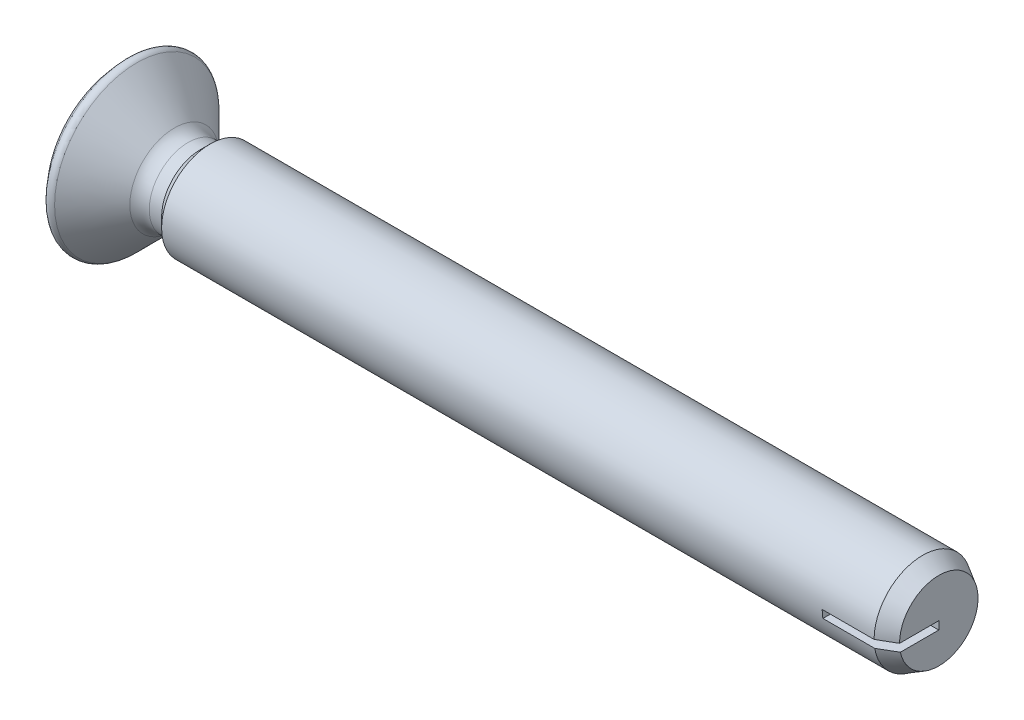
ISO-10303-21;
HEADER;
FILE_DESCRIPTION(('STEP AP214'),'2;1');
FILE_NAME('part.step','',(''),(''),'','','');
FILE_SCHEMA(('AUTOMOTIVE_DESIGN { 1 0 10303 214 1 1 1 1 }'));
ENDSEC;
DATA;
#1=APPLICATION_CONTEXT('core data for automotive mechanical design processes');
#2=APPLICATION_PROTOCOL_DEFINITION('international standard','automotive_design',2000,#1);
#3=PRODUCT_CONTEXT('',#1,'mechanical');
#4=PRODUCT('Part','Part','',(#3));
#5=PRODUCT_RELATED_PRODUCT_CATEGORY('part','',(#4));
#6=PRODUCT_DEFINITION_FORMATION('','',#4);
#7=PRODUCT_DEFINITION_CONTEXT('part definition',#1,'design');
#8=PRODUCT_DEFINITION('design','',#6,#7);
#9=PRODUCT_DEFINITION_SHAPE('','',#8);
#10=(LENGTH_UNIT() NAMED_UNIT(*) SI_UNIT(.MILLI.,.METRE.));
#11=(NAMED_UNIT(*) PLANE_ANGLE_UNIT() SI_UNIT($,.RADIAN.));
#12=(NAMED_UNIT(*) SI_UNIT($,.STERADIAN.) SOLID_ANGLE_UNIT());
#13=UNCERTAINTY_MEASURE_WITH_UNIT(LENGTH_MEASURE(1.E-05),#10,'distance_accuracy_value','');
#14=(GEOMETRIC_REPRESENTATION_CONTEXT(3) GLOBAL_UNCERTAINTY_ASSIGNED_CONTEXT((#13)) GLOBAL_UNIT_ASSIGNED_CONTEXT((#10,
#11,#12)) REPRESENTATION_CONTEXT('',''));
#15=CARTESIAN_POINT('',(0.,0.,0.));
#16=DIRECTION('',(0.,0.,1.));
#17=DIRECTION('',(1.,0.,0.));
#18=AXIS2_PLACEMENT_3D('',#15,#16,#17);
#19=CARTESIAN_POINT('',(0.,0.,0.));
#20=DIRECTION('',(-1.,0.,0.));
#21=DIRECTION('',(0.,0.,1.));
#22=AXIS2_PLACEMENT_3D('',#19,#20,#21);
#23=CYLINDRICAL_SURFACE('',#22,5.);
#24=CARTESIAN_POINT('',(8.00000000000001,0.,0.));
#25=DIRECTION('',(-1.,0.,0.));
#26=DIRECTION('',(0.,0.,1.));
#27=AXIS2_PLACEMENT_3D('',#24,#25,#26);
#28=CIRCLE('',#27,5.);
#29=CARTESIAN_POINT('',(8.00000000000001,0.,5.));
#30=VERTEX_POINT('',#29);
#31=EDGE_CURVE('E305',#30,#30,#28,.T.);
#32=ORIENTED_EDGE('',*,*,#31,.F.);
#33=EDGE_LOOP('',(#32));
#34=FACE_BOUND('',#33,.T.);
#35=DIRECTION('',(-1.,0.,0.));
#36=VECTOR('',#35,1.);
#37=CARTESIAN_POINT('',(0.,0.,5.));
#38=LINE('',#37,#36);
#39=CARTESIAN_POINT('',(81.3372312247339,0.,5.00000000000001));
#40=VERTEX_POINT('',#39);
#41=CARTESIAN_POINT('',(76.,0.,5.));
#42=VERTEX_POINT('',#41);
#43=EDGE_CURVE('E377',#40,#42,#38,.T.);
#44=ORIENTED_EDGE('',*,*,#43,.F.);
#45=CARTESIAN_POINT('',(81.3372312247339,0.,0.));
#46=DIRECTION('',(-1.,0.,0.));
#47=DIRECTION('',(0.,0.,1.));
#48=AXIS2_PLACEMENT_3D('',#45,#46,#47);
#49=CIRCLE('',#48,5.);
#50=CARTESIAN_POINT('',(81.3372312247339,-0.833333333333333,4.93006648591635));
#51=VERTEX_POINT('',#50);
#52=EDGE_CURVE('E374',#40,#51,#49,.T.);
#53=ORIENTED_EDGE('',*,*,#52,.T.);
#54=DIRECTION('',(-1.,0.,0.));
#55=VECTOR('',#54,1.);
#56=CARTESIAN_POINT('',(0.,-0.833333333333343,4.93006648591635));
#57=LINE('',#56,#55);
#58=CARTESIAN_POINT('',(76.,-0.833333333333334,4.93006648591635));
#59=VERTEX_POINT('',#58);
#60=EDGE_CURVE('E381',#59,#51,#57,.F.);
#61=ORIENTED_EDGE('',*,*,#60,.F.);
#62=CARTESIAN_POINT('',(76.,0.,0.));
#63=DIRECTION('',(1.,0.,0.));
#64=DIRECTION('',(0.,0.,-1.));
#65=AXIS2_PLACEMENT_3D('',#62,#63,#64);
#66=CIRCLE('',#65,5.);
#67=EDGE_CURVE('E43',#42,#59,#66,.T.);
#68=ORIENTED_EDGE('',*,*,#67,.F.);
#69=EDGE_LOOP('',(#44,#53,#61,#68));
#70=FACE_BOUND('',#69,.T.);
#71=ADVANCED_FACE('F70',(#34,#70),#23,.T.);
#72=CARTESIAN_POINT('',(81.3372312247339,0.,0.));
#73=DIRECTION('',(-1.,0.,0.));
#74=DIRECTION('',(0.,0.,1.));
#75=AXIS2_PLACEMENT_3D('',#72,#73,#74);
#76=CONICAL_SURFACE('',#75,5.,0.523598775598297);
#77=ORIENTED_EDGE('',*,*,#52,.F.);
#78=DIRECTION('',(-0.86602540378444,0.,0.499999999999998));
#79=VECTOR('',#78,1.);
#80=CARTESIAN_POINT('',(89.9974852625783,0.,0.));
#81=LINE('',#80,#79);
#82=CARTESIAN_POINT('',(83.,0.,4.04));
#83=VERTEX_POINT('',#82);
#84=EDGE_CURVE('E379',#40,#83,#81,.F.);
#85=ORIENTED_EDGE('',*,*,#84,.T.);
#86=CARTESIAN_POINT('',(83.,0.,0.));
#87=DIRECTION('',(-1.,0.,0.));
#88=DIRECTION('',(0.,0.,1.));
#89=AXIS2_PLACEMENT_3D('',#86,#87,#88);
#90=CIRCLE('',#89,4.04);
#91=CARTESIAN_POINT('',(83.,-0.833333333333333,3.95311972441457));
#92=VERTEX_POINT('',#91);
#93=EDGE_CURVE('E232',#83,#92,#90,.T.);
#94=ORIENTED_EDGE('',*,*,#93,.T.);
#95=CARTESIAN_POINT('',(87.3247639619559,-0.833333333333332,1.29873089558835));
#96=CARTESIAN_POINT('',(87.2539941704602,-0.833333333333332,1.34725537138204));
#97=CARTESIAN_POINT('',(87.1828785114112,-0.833333333333332,1.39526964887622));
#98=CARTESIAN_POINT('',(87.0401016315832,-0.833333333333332,1.49047344700936));
#99=CARTESIAN_POINT('',(86.9684404371539,-0.833333333333333,1.53766300712427));
#100=CARTESIAN_POINT('',(86.8247211543455,-0.833333333333333,1.6314115539144));
#101=CARTESIAN_POINT('',(86.752663118618,-0.833333333333333,1.67797062153478));
#102=CARTESIAN_POINT('',(86.6082258623107,-0.833333333333333,1.77058968692903));
#103=CARTESIAN_POINT('',(86.5358466372734,-0.833333333333333,1.81664967774568));
#104=CARTESIAN_POINT('',(86.3183642112331,-0.833333333333333,1.95421200872288));
#105=CARTESIAN_POINT('',(86.1728838142965,-0.833333333333333,2.04511773162643));
#106=CARTESIAN_POINT('',(85.8812495364593,-0.833333333333333,2.22585256137799));
#107=CARTESIAN_POINT('',(85.7350956278256,-0.833333333333333,2.31568162333395));
#108=CARTESIAN_POINT('',(85.3080852699756,-0.833333333333333,2.57660770394157));
#109=CARTESIAN_POINT('',(85.026608833395,-0.833333333333333,2.7466892729844));
#110=CARTESIAN_POINT('',(84.4627141115085,-0.833333333333333,3.08527145364155));
#111=CARTESIAN_POINT('',(84.1802958355546,-0.833333333333333,3.25377208089114));
#112=CARTESIAN_POINT('',(83.6148051769543,-0.833333333333333,3.58980112792523));
#113=CARTESIAN_POINT('',(83.3317326746539,-0.833333333333333,3.75732934627969));
#114=CARTESIAN_POINT('',(82.7651904009645,-0.833333333333333,4.09171283682867));
#115=CARTESIAN_POINT('',(82.4817206290751,-0.833333333333333,4.25856810817449));
#116=CARTESIAN_POINT('',(81.7666378111784,-0.833333333333333,4.67868104235534));
#117=CARTESIAN_POINT('',(81.3348433243253,-0.833333333333333,4.93162979117258));
#118=CARTESIAN_POINT('',(80.4708588506733,-0.833333333333333,5.43685048612455));
#119=CARTESIAN_POINT('',(80.038668863839,-0.833333333333333,5.68912243219864));
#120=CARTESIAN_POINT('',(79.1741907921081,-0.833333333333334,6.19311639762208));
#121=CARTESIAN_POINT('',(78.7419028086198,-0.833333333333334,6.44483859095241));
#122=CARTESIAN_POINT('',(77.87713712025,-0.833333333333334,6.94795546546835));
#123=CARTESIAN_POINT('',(77.4446594156462,-0.833333333333334,7.19935014713161));
#124=CARTESIAN_POINT('',(77.012123316864,-0.833333333333334,7.45064407792756));
#125=B_SPLINE_CURVE_WITH_KNOTS('',3,(#95,#96,#97,#98,#99,#100,#101,#102,#103,#104,#105,#106,
#107,#108,#109,#110,#111,#112,#113,#114,#115,#116,#117,#118,#119,#120,#121,#122,#123,#124),
.UNSPECIFIED.,.F.,.F.,(4,2,2,2,2,2,2,2,2,2,2,2,2,2,4),(0.,0.257416666427772,0.514820977404478,
0.77219192235244,1.02956645049407,1.54419953035654,2.0588539940456,3.04545828859046,
4.03205281546696,5.01884489709274,6.00563822283812,7.50692516636696,9.00821224437486,
10.5089227938863,12.0096311523225),.UNSPECIFIED.);
#126=EDGE_CURVE('E383',#92,#51,#125,.T.);
#127=ORIENTED_EDGE('',*,*,#126,.T.);
#128=EDGE_LOOP('',(#77,#85,#94,#127));
#129=FACE_BOUND('',#128,.T.);
#130=ADVANCED_FACE('F393',(#129),#76,.T.);
#131=CARTESIAN_POINT('',(83.,5.,0.));
#132=DIRECTION('',(-1.,0.,0.));
#133=DIRECTION('',(0.,0.,1.));
#134=AXIS2_PLACEMENT_3D('',#131,#132,#133);
#135=PLANE('',#134);
#136=DIRECTION('',(0.,0.,1.));
#137=VECTOR('',#136,1.);
#138=CARTESIAN_POINT('',(83.,0.,0.));
#139=LINE('',#138,#137);
#140=CARTESIAN_POINT('',(83.,0.,0.));
#141=VERTEX_POINT('',#140);
#142=EDGE_CURVE('E78',#141,#83,#139,.T.);
#143=ORIENTED_EDGE('',*,*,#142,.F.);
#144=DIRECTION('',(0.,1.,0.));
#145=VECTOR('',#144,1.);
#146=CARTESIAN_POINT('',(83.,0.,0.));
#147=LINE('',#146,#145);
#148=CARTESIAN_POINT('',(83.,-0.833333333333334,0.));
#149=VERTEX_POINT('',#148);
#150=EDGE_CURVE('E222',#149,#141,#147,.T.);
#151=ORIENTED_EDGE('',*,*,#150,.F.);
#152=DIRECTION('',(0.,0.,-1.));
#153=VECTOR('',#152,1.);
#154=CARTESIAN_POINT('',(83.,-0.833333333333333,0.));
#155=LINE('',#154,#153);
#156=EDGE_CURVE('E233',#92,#149,#155,.T.);
#157=ORIENTED_EDGE('',*,*,#156,.F.);
#158=ORIENTED_EDGE('',*,*,#93,.F.);
#159=EDGE_LOOP('',(#143,#151,#157,#158));
#160=FACE_BOUND('',#159,.T.);
#161=ADVANCED_FACE('F230',(#160),#135,.F.);
#162=CARTESIAN_POINT('',(8.45228331927532,0.,0.));
#163=DIRECTION('',(-1.,0.,0.));
#164=DIRECTION('',(0.,1.,0.));
#165=AXIS2_PLACEMENT_3D('',#162,#163,#164);
#166=SPHERICAL_SURFACE('',#165,12.2740007051205);
#167=CARTESIAN_POINT('',(-0.45348757445134,0.,0.));
#168=DIRECTION('',(-1.,0.,0.));
#169=DIRECTION('',(0.,0.,1.));
#170=AXIS2_PLACEMENT_3D('',#167,#168,#169);
#171=CIRCLE('',#170,8.44620258446071);
#172=CARTESIAN_POINT('',(-0.45348757445134,0.,8.44620258446071));
#173=VERTEX_POINT('',#172);
#174=EDGE_CURVE('E270',#173,#173,#171,.T.);
#175=ORIENTED_EDGE('',*,*,#174,.T.);
#176=EDGE_LOOP('',(#175));
#177=FACE_BOUND('',#176,.T.);
#178=CARTESIAN_POINT('',(8.45228331927532,-0.99,0.));
#179=DIRECTION('',(0.,1.,0.));
#180=DIRECTION('',(0.,0.,1.));
#181=AXIS2_PLACEMENT_3D('',#178,#179,#180);
#182=CIRCLE('',#181,12.2340096987578);
#183=CARTESIAN_POINT('',(-3.62076556281324,-0.99,1.978));
#184=VERTEX_POINT('',#183);
#185=CARTESIAN_POINT('',(-2.88444746433884,-0.99,4.59886164709865));
#186=VERTEX_POINT('',#185);
#187=EDGE_CURVE('E266',#184,#186,#182,.T.);
#188=ORIENTED_EDGE('',*,*,#187,.F.);
#189=CARTESIAN_POINT('',(8.45228331927532,-1.484,1.484));
#190=DIRECTION('',(0.,-0.707106781186548,0.707106781186548));
#191=DIRECTION('',(0.,-0.707106781186548,-0.707106781186548));
#192=AXIS2_PLACEMENT_3D('',#189,#190,#191);
#193=CIRCLE('',#192,12.0932452761573);
#194=CARTESIAN_POINT('',(-3.62076556281324,-1.978,0.99));
#195=VERTEX_POINT('',#194);
#196=EDGE_CURVE('E361',#184,#195,#193,.T.);
#197=ORIENTED_EDGE('',*,*,#196,.T.);
#198=CARTESIAN_POINT('',(8.45228331927532,0.,0.989999999999999));
#199=DIRECTION('',(0.,0.,-1.));
#200=DIRECTION('',(0.,1.,0.));
#201=AXIS2_PLACEMENT_3D('',#198,#199,#200);
#202=CIRCLE('',#201,12.2340096987578);
#203=CARTESIAN_POINT('',(-2.88444746433884,-4.59886164709865,0.99));
#204=VERTEX_POINT('',#203);
#205=EDGE_CURVE('E251',#204,#195,#202,.T.);
#206=ORIENTED_EDGE('',*,*,#205,.F.);
#207=CARTESIAN_POINT('',(8.6041833801388,-0.417341987236199,0.));
#208=DIRECTION('',(-0.342020143325669,0.939692620785908,0.));
#209=DIRECTION('',(-0.939692620785908,-0.342020143325669,0.));
#210=AXIS2_PLACEMENT_3D('',#207,#208,#209);
#211=CIRCLE('',#210,12.2659628788978);
#212=CARTESIAN_POINT('',(-2.88444746433884,-4.59886164709865,-0.99));
#213=VERTEX_POINT('',#212);
#214=EDGE_CURVE('E249',#213,#204,#211,.T.);
#215=ORIENTED_EDGE('',*,*,#214,.F.);
#216=CARTESIAN_POINT('',(8.45228331927532,0.,-0.99));
#217=DIRECTION('',(0.,0.,1.));
#218=DIRECTION('',(0.,-1.,0.));
#219=AXIS2_PLACEMENT_3D('',#216,#217,#218);
#220=CIRCLE('',#219,12.2340096987578);
#221=CARTESIAN_POINT('',(-3.62076556281324,-1.978,-0.99));
#222=VERTEX_POINT('',#221);
#223=EDGE_CURVE('E252',#222,#213,#220,.T.);
#224=ORIENTED_EDGE('',*,*,#223,.F.);
#225=CARTESIAN_POINT('',(8.45228331927532,-1.484,-1.484));
#226=DIRECTION('',(0.,-0.707106781186548,-0.707106781186548));
#227=DIRECTION('',(0.,0.707106781186548,-0.707106781186548));
#228=AXIS2_PLACEMENT_3D('',#225,#226,#227);
#229=CIRCLE('',#228,12.0932452761573);
#230=CARTESIAN_POINT('',(-3.62076556281324,-0.99,-1.978));
#231=VERTEX_POINT('',#230);
#232=EDGE_CURVE('E352',#222,#231,#229,.T.);
#233=ORIENTED_EDGE('',*,*,#232,.T.);
#234=CARTESIAN_POINT('',(8.45228331927532,-0.99,0.));
#235=DIRECTION('',(0.,1.,0.));
#236=DIRECTION('',(0.,0.,1.));
#237=AXIS2_PLACEMENT_3D('',#234,#235,#236);
#238=CIRCLE('',#237,12.2340096987578);
#239=CARTESIAN_POINT('',(-2.88444746433884,-0.99,-4.59886164709865));
#240=VERTEX_POINT('',#239);
#241=EDGE_CURVE('E291',#240,#231,#238,.T.);
#242=ORIENTED_EDGE('',*,*,#241,.F.);
#243=CARTESIAN_POINT('',(8.6041833801388,0.,-0.417341987236199));
#244=DIRECTION('',(-0.342020143325669,0.,0.939692620785908));
#245=DIRECTION('',(0.939692620785908,0.,0.342020143325669));
#246=AXIS2_PLACEMENT_3D('',#243,#244,#245);
#247=CIRCLE('',#246,12.2659628788978);
#248=CARTESIAN_POINT('',(-2.88444746433884,0.99,-4.59886164709865));
#249=VERTEX_POINT('',#248);
#250=EDGE_CURVE('E289',#249,#240,#247,.T.);
#251=ORIENTED_EDGE('',*,*,#250,.F.);
#252=CARTESIAN_POINT('',(8.45228331927532,0.99,0.));
#253=DIRECTION('',(0.,-1.,0.));
#254=DIRECTION('',(0.,0.,-1.));
#255=AXIS2_PLACEMENT_3D('',#252,#253,#254);
#256=CIRCLE('',#255,12.2340096987578);
#257=CARTESIAN_POINT('',(-3.62076556281324,0.99,-1.978));
#258=VERTEX_POINT('',#257);
#259=EDGE_CURVE('E292',#258,#249,#256,.T.);
#260=ORIENTED_EDGE('',*,*,#259,.F.);
#261=CARTESIAN_POINT('',(8.45228331927532,1.484,-1.484));
#262=DIRECTION('',(0.,0.707106781186547,-0.707106781186548));
#263=DIRECTION('',(0.,0.707106781186548,0.707106781186547));
#264=AXIS2_PLACEMENT_3D('',#261,#262,#263);
#265=CIRCLE('',#264,12.0932452761573);
#266=CARTESIAN_POINT('',(-3.62076556281324,1.978,-0.99));
#267=VERTEX_POINT('',#266);
#268=EDGE_CURVE('E341',#258,#267,#265,.T.);
#269=ORIENTED_EDGE('',*,*,#268,.T.);
#270=CARTESIAN_POINT('',(8.45228331927532,0.,-0.99));
#271=DIRECTION('',(0.,0.,1.));
#272=DIRECTION('',(0.,-1.,0.));
#273=AXIS2_PLACEMENT_3D('',#270,#271,#272);
#274=CIRCLE('',#273,12.2340096987578);
#275=CARTESIAN_POINT('',(-2.88444746433884,4.59886164709865,-0.99));
#276=VERTEX_POINT('',#275);
#277=EDGE_CURVE('E234',#276,#267,#274,.T.);
#278=ORIENTED_EDGE('',*,*,#277,.F.);
#279=CARTESIAN_POINT('',(8.6041833801388,0.417341987236199,0.));
#280=DIRECTION('',(-0.342020143325669,-0.939692620785908,0.));
#281=DIRECTION('',(0.939692620785908,-0.342020143325669,0.));
#282=AXIS2_PLACEMENT_3D('',#279,#280,#281);
#283=CIRCLE('',#282,12.2659628788978);
#284=CARTESIAN_POINT('',(-2.88444746433884,4.59886164709865,0.99));
#285=VERTEX_POINT('',#284);
#286=EDGE_CURVE('E277',#285,#276,#283,.T.);
#287=ORIENTED_EDGE('',*,*,#286,.F.);
#288=CARTESIAN_POINT('',(8.45228331927532,0.,0.989999999999999));
#289=DIRECTION('',(0.,0.,-1.));
#290=DIRECTION('',(0.,1.,0.));
#291=AXIS2_PLACEMENT_3D('',#288,#289,#290);
#292=CIRCLE('',#291,12.2340096987578);
#293=CARTESIAN_POINT('',(-3.62076556281324,1.978,0.99));
#294=VERTEX_POINT('',#293);
#295=EDGE_CURVE('E279',#294,#285,#292,.T.);
#296=ORIENTED_EDGE('',*,*,#295,.F.);
#297=CARTESIAN_POINT('',(8.45228331927532,1.484,1.484));
#298=DIRECTION('',(0.,0.707106781186547,0.707106781186548));
#299=DIRECTION('',(0.,-0.707106781186548,0.707106781186547));
#300=AXIS2_PLACEMENT_3D('',#297,#298,#299);
#301=CIRCLE('',#300,12.0932452761573);
#302=CARTESIAN_POINT('',(-3.62076556281324,0.99,1.978));
#303=VERTEX_POINT('',#302);
#304=EDGE_CURVE('E334',#294,#303,#301,.T.);
#305=ORIENTED_EDGE('',*,*,#304,.T.);
#306=CARTESIAN_POINT('',(8.45228331927532,0.99,0.));
#307=DIRECTION('',(0.,-1.,0.));
#308=DIRECTION('',(0.,0.,-1.));
#309=AXIS2_PLACEMENT_3D('',#306,#307,#308);
#310=CIRCLE('',#309,12.2340096987578);
#311=CARTESIAN_POINT('',(-2.88444746433884,0.99,4.59886164709865));
#312=VERTEX_POINT('',#311);
#313=EDGE_CURVE('E265',#312,#303,#310,.T.);
#314=ORIENTED_EDGE('',*,*,#313,.F.);
#315=CARTESIAN_POINT('',(8.6041833801388,0.,0.417341987236199));
#316=DIRECTION('',(-0.342020143325669,0.,-0.939692620785908));
#317=DIRECTION('',(-0.939692620785908,0.,0.342020143325669));
#318=AXIS2_PLACEMENT_3D('',#315,#316,#317);
#319=CIRCLE('',#318,12.2659628788978);
#320=EDGE_CURVE('E263',#186,#312,#319,.T.);
#321=ORIENTED_EDGE('',*,*,#320,.F.);
#322=EDGE_LOOP('',(#188,#197,#206,#215,#224,#233,#242,#251,#260,#269,#278,#287,#296,#305,#314,#321));
#323=FACE_BOUND('',#322,.T.);
#324=ADVANCED_FACE('F425',(#177,#323),#166,.T.);
#325=CARTESIAN_POINT('',(8.00000000000001,0.,0.));
#326=DIRECTION('',(1.,0.,0.));
#327=DIRECTION('',(0.,0.,-1.));
#328=AXIS2_PLACEMENT_3D('',#325,#326,#327);
#329=CONICAL_SURFACE('',#328,5.,0.785398163397444);
#330=CARTESIAN_POINT('',(6.99999999999999,0.,0.));
#331=DIRECTION('',(-1.,0.,0.));
#332=DIRECTION('',(0.,0.,1.));
#333=AXIS2_PLACEMENT_3D('',#330,#331,#332);
#334=CIRCLE('',#333,4.);
#335=CARTESIAN_POINT('',(6.99999999999999,0.,4.));
#336=VERTEX_POINT('',#335);
#337=EDGE_CURVE('E308',#336,#336,#334,.T.);
#338=ORIENTED_EDGE('',*,*,#337,.F.);
#339=EDGE_LOOP('',(#338));
#340=FACE_BOUND('',#339,.T.);
#341=ORIENTED_EDGE('',*,*,#31,.T.);
#342=EDGE_LOOP('',(#341));
#343=FACE_BOUND('',#342,.T.);
#344=ADVANCED_FACE('F421',(#340,#343),#329,.T.);
#345=CARTESIAN_POINT('',(0.,0.,0.));
#346=DIRECTION('',(-1.,0.,0.));
#347=DIRECTION('',(0.,0.,1.));
#348=AXIS2_PLACEMENT_3D('',#345,#346,#347);
#349=CYLINDRICAL_SURFACE('',#348,4.);
#350=CARTESIAN_POINT('',(5.72842712474618,0.,0.));
#351=DIRECTION('',(-1.,0.,0.));
#352=DIRECTION('',(0.,0.,1.));
#353=AXIS2_PLACEMENT_3D('',#350,#351,#352);
#354=CIRCLE('',#353,4.);
#355=CARTESIAN_POINT('',(5.72842712474618,0.,4.));
#356=VERTEX_POINT('',#355);
#357=EDGE_CURVE('E311',#356,#356,#354,.T.);
#358=ORIENTED_EDGE('',*,*,#357,.F.);
#359=EDGE_LOOP('',(#358));
#360=FACE_BOUND('',#359,.T.);
#361=ORIENTED_EDGE('',*,*,#337,.T.);
#362=EDGE_LOOP('',(#361));
#363=FACE_BOUND('',#362,.T.);
#364=ADVANCED_FACE('F526',(#360,#363),#349,.T.);
#365=CARTESIAN_POINT('',(5.72842712474618,0.,0.));
#366=DIRECTION('',(-1.,0.,0.));
#367=DIRECTION('',(0.,0.,1.));
#368=AXIS2_PLACEMENT_3D('',#365,#366,#367);
#369=TOROIDAL_SURFACE('',#368,6.,2.);
#370=CARTESIAN_POINT('',(4.31421356237308,0.,0.));
#371=DIRECTION('',(-1.,0.,0.));
#372=DIRECTION('',(0.,0.,1.));
#373=AXIS2_PLACEMENT_3D('',#370,#371,#372);
#374=CIRCLE('',#373,4.58578643762691);
#375=CARTESIAN_POINT('',(4.31421356237308,0.,4.58578643762691));
#376=VERTEX_POINT('',#375);
#377=EDGE_CURVE('E314',#376,#376,#374,.T.);
#378=ORIENTED_EDGE('',*,*,#377,.F.);
#379=EDGE_LOOP('',(#378));
#380=FACE_BOUND('',#379,.T.);
#381=ORIENTED_EDGE('',*,*,#357,.T.);
#382=EDGE_LOOP('',(#381));
#383=FACE_BOUND('',#382,.T.);
#384=ADVANCED_FACE('F523',(#380,#383),#369,.F.);
#385=CARTESIAN_POINT('',(4.31421356237308,0.,0.));
#386=DIRECTION('',(-1.,0.,0.));
#387=DIRECTION('',(0.,0.,1.));
#388=AXIS2_PLACEMENT_3D('',#385,#386,#387);
#389=CONICAL_SURFACE('',#388,4.58578643762691,0.78539816339745);
#390=CARTESIAN_POINT('',(0.441941738241592,0.,0.));
#391=DIRECTION('',(-1.,0.,0.));
#392=DIRECTION('',(0.,0.,1.));
#393=AXIS2_PLACEMENT_3D('',#390,#391,#392);
#394=CIRCLE('',#393,8.45805826175841);
#395=CARTESIAN_POINT('',(0.441941738241592,0.,8.45805826175841));
#396=VERTEX_POINT('',#395);
#397=EDGE_CURVE('E317',#396,#396,#394,.T.);
#398=ORIENTED_EDGE('',*,*,#397,.F.);
#399=EDGE_LOOP('',(#398));
#400=FACE_BOUND('',#399,.T.);
#401=ORIENTED_EDGE('',*,*,#377,.T.);
#402=EDGE_LOOP('',(#401));
#403=FACE_BOUND('',#402,.T.);
#404=ADVANCED_FACE('F517',(#400,#403),#389,.T.);
#405=CARTESIAN_POINT('',(0.,0.,0.));
#406=DIRECTION('',(-1.,0.,0.));
#407=DIRECTION('',(0.,0.,1.));
#408=AXIS2_PLACEMENT_3D('',#405,#406,#407);
#409=TOROIDAL_SURFACE('',#408,8.01611652351682,0.624999999999999);
#410=ORIENTED_EDGE('',*,*,#174,.F.);
#411=EDGE_LOOP('',(#410));
#412=FACE_BOUND('',#411,.T.);
#413=ORIENTED_EDGE('',*,*,#397,.T.);
#414=EDGE_LOOP('',(#413));
#415=FACE_BOUND('',#414,.T.);
#416=ADVANCED_FACE('F512',(#412,#415),#409,.T.);
#417=CARTESIAN_POINT('',(-1.32171738584523,4.94,-0.99));
#418=DIRECTION('',(0.,0.,1.));
#419=DIRECTION('',(0.,-1.,0.));
#420=AXIS2_PLACEMENT_3D('',#417,#418,#419);
#421=PLANE('',#420);
#422=DIRECTION('',(-1.,0.,0.));
#423=VECTOR('',#422,1.);
#424=CARTESIAN_POINT('',(0.0755256137793849,1.978,-0.99));
#425=LINE('',#424,#423);
#426=CARTESIAN_POINT('',(-1.32171738584523,1.978,-0.99));
#427=VERTEX_POINT('',#426);
#428=EDGE_CURVE('E350',#427,#267,#425,.T.);
#429=ORIENTED_EDGE('',*,*,#428,.F.);
#430=DIRECTION('',(0.,1.,0.));
#431=VECTOR('',#430,1.);
#432=CARTESIAN_POINT('',(-1.32171738584523,4.94,-0.99));
#433=LINE('',#432,#431);
#434=CARTESIAN_POINT('',(-1.32171738584523,4.03007441433449,-0.99));
#435=VERTEX_POINT('',#434);
#436=EDGE_CURVE('E274',#427,#435,#433,.T.);
#437=ORIENTED_EDGE('',*,*,#436,.T.);
#438=DIRECTION('',(-0.939692620785908,0.342020143325669,0.));
#439=VECTOR('',#438,1.);
#440=CARTESIAN_POINT('',(-3.82171738584523,4.94,-0.99));
#441=LINE('',#440,#439);
#442=EDGE_CURVE('E267',#435,#276,#441,.T.);
#443=ORIENTED_EDGE('',*,*,#442,.T.);
#444=ORIENTED_EDGE('',*,*,#277,.T.);
#445=EDGE_LOOP('',(#429,#437,#443,#444));
#446=FACE_BOUND('',#445,.T.);
#447=ADVANCED_FACE('F504',(#446),#421,.T.);
#448=CARTESIAN_POINT('',(-3.82171738584523,4.94,0.));
#449=DIRECTION('',(-0.342020143325669,-0.939692620785908,0.));
#450=DIRECTION('',(0.939692620785908,-0.342020143325669,0.));
#451=AXIS2_PLACEMENT_3D('',#448,#449,#450);
#452=PLANE('',#451);
#453=ORIENTED_EDGE('',*,*,#286,.T.);
#454=ORIENTED_EDGE('',*,*,#442,.F.);
#455=DIRECTION('',(0.,0.,1.));
#456=VECTOR('',#455,1.);
#457=CARTESIAN_POINT('',(-1.32171738584523,4.03007441433449,-0.99));
#458=LINE('',#457,#456);
#459=CARTESIAN_POINT('',(-1.32171738584523,4.03007441433449,0.99));
#460=VERTEX_POINT('',#459);
#461=EDGE_CURVE('E271',#435,#460,#458,.T.);
#462=ORIENTED_EDGE('',*,*,#461,.T.);
#463=DIRECTION('',(-0.939692620785908,0.342020143325669,0.));
#464=VECTOR('',#463,1.);
#465=CARTESIAN_POINT('',(-1.61416183194651,4.13651548789183,0.99));
#466=LINE('',#465,#464);
#467=EDGE_CURVE('E256',#460,#285,#466,.T.);
#468=ORIENTED_EDGE('',*,*,#467,.T.);
#469=EDGE_LOOP('',(#453,#454,#462,#468));
#470=FACE_BOUND('',#469,.T.);
#471=ADVANCED_FACE('F72',(#470),#452,.T.);
#472=CARTESIAN_POINT('',(-1.32171738584523,4.94,0.99));
#473=DIRECTION('',(0.,0.,-1.));
#474=DIRECTION('',(0.,1.,0.));
#475=AXIS2_PLACEMENT_3D('',#472,#473,#474);
#476=PLANE('',#475);
#477=DIRECTION('',(-1.,0.,0.));
#478=VECTOR('',#477,1.);
#479=CARTESIAN_POINT('',(0.0755256137793849,1.978,0.99));
#480=LINE('',#479,#478);
#481=CARTESIAN_POINT('',(-1.32171738584523,1.978,0.99));
#482=VERTEX_POINT('',#481);
#483=EDGE_CURVE('E340',#482,#294,#480,.T.);
#484=ORIENTED_EDGE('',*,*,#483,.T.);
#485=ORIENTED_EDGE('',*,*,#295,.T.);
#486=ORIENTED_EDGE('',*,*,#467,.F.);
#487=DIRECTION('',(0.,-1.,0.));
#488=VECTOR('',#487,1.);
#489=CARTESIAN_POINT('',(-1.32171738584523,4.94,0.99));
#490=LINE('',#489,#488);
#491=EDGE_CURVE('E273',#460,#482,#490,.T.);
#492=ORIENTED_EDGE('',*,*,#491,.T.);
#493=EDGE_LOOP('',(#484,#485,#486,#492));
#494=FACE_BOUND('',#493,.T.);
#495=ADVANCED_FACE('F451',(#494),#476,.T.);
#496=CARTESIAN_POINT('',(-1.32171738584523,0.99,0.99));
#497=DIRECTION('',(0.,-1.,0.));
#498=DIRECTION('',(0.,0.,-1.));
#499=AXIS2_PLACEMENT_3D('',#496,#497,#498);
#500=PLANE('',#499);
#501=DIRECTION('',(-1.,0.,0.));
#502=VECTOR('',#501,1.);
#503=CARTESIAN_POINT('',(0.0755256137793849,0.99,1.978));
#504=LINE('',#503,#502);
#505=CARTESIAN_POINT('',(-1.32171738584523,0.99,1.978));
#506=VERTEX_POINT('',#505);
#507=EDGE_CURVE('E338',#506,#303,#504,.T.);
#508=ORIENTED_EDGE('',*,*,#507,.F.);
#509=DIRECTION('',(0.,0.,1.));
#510=VECTOR('',#509,1.);
#511=CARTESIAN_POINT('',(-1.32171738584523,0.99,0.99));
#512=LINE('',#511,#510);
#513=CARTESIAN_POINT('',(-1.32171738584523,0.99,4.03007441433449));
#514=VERTEX_POINT('',#513);
#515=EDGE_CURVE('E260',#506,#514,#512,.T.);
#516=ORIENTED_EDGE('',*,*,#515,.T.);
#517=DIRECTION('',(-0.939692620785908,0.,0.342020143325669));
#518=VECTOR('',#517,1.);
#519=CARTESIAN_POINT('',(-3.82171738584523,0.99,4.94));
#520=LINE('',#519,#518);
#521=EDGE_CURVE('E253',#514,#312,#520,.T.);
#522=ORIENTED_EDGE('',*,*,#521,.T.);
#523=ORIENTED_EDGE('',*,*,#313,.T.);
#524=EDGE_LOOP('',(#508,#516,#522,#523));
#525=FACE_BOUND('',#524,.T.);
#526=ADVANCED_FACE('F443',(#525),#500,.T.);
#527=CARTESIAN_POINT('',(-3.82171738584523,0.,4.94));
#528=DIRECTION('',(-0.342020143325669,0.,-0.939692620785908));
#529=DIRECTION('',(-0.939692620785908,0.,0.342020143325669));
#530=AXIS2_PLACEMENT_3D('',#527,#528,#529);
#531=PLANE('',#530);
#532=ORIENTED_EDGE('',*,*,#320,.T.);
#533=ORIENTED_EDGE('',*,*,#521,.F.);
#534=DIRECTION('',(0.,-1.,0.));
#535=VECTOR('',#534,1.);
#536=CARTESIAN_POINT('',(-1.32171738584523,0.99,4.03007441433449));
#537=LINE('',#536,#535);
#538=CARTESIAN_POINT('',(-1.32171738584523,-0.99,4.03007441433449));
#539=VERTEX_POINT('',#538);
#540=EDGE_CURVE('E257',#514,#539,#537,.T.);
#541=ORIENTED_EDGE('',*,*,#540,.T.);
#542=DIRECTION('',(-0.939692620785908,0.,0.342020143325669));
#543=VECTOR('',#542,1.);
#544=CARTESIAN_POINT('',(-0.344656302815594,-0.99,3.6744532630518));
#545=LINE('',#544,#543);
#546=EDGE_CURVE('E240',#539,#186,#545,.T.);
#547=ORIENTED_EDGE('',*,*,#546,.T.);
#548=EDGE_LOOP('',(#532,#533,#541,#547));
#549=FACE_BOUND('',#548,.T.);
#550=ADVANCED_FACE('F440',(#549),#531,.T.);
#551=CARTESIAN_POINT('',(-1.32171738584523,-0.99,0.989999999999999));
#552=DIRECTION('',(0.,1.,0.));
#553=DIRECTION('',(0.,0.,1.));
#554=AXIS2_PLACEMENT_3D('',#551,#552,#553);
#555=PLANE('',#554);
#556=DIRECTION('',(-1.,0.,0.));
#557=VECTOR('',#556,1.);
#558=CARTESIAN_POINT('',(0.0755256137793849,-0.99,1.978));
#559=LINE('',#558,#557);
#560=CARTESIAN_POINT('',(-1.32171738584523,-0.99,1.978));
#561=VERTEX_POINT('',#560);
#562=EDGE_CURVE('E368',#561,#184,#559,.T.);
#563=ORIENTED_EDGE('',*,*,#562,.T.);
#564=ORIENTED_EDGE('',*,*,#187,.T.);
#565=ORIENTED_EDGE('',*,*,#546,.F.);
#566=DIRECTION('',(0.,0.,-1.));
#567=VECTOR('',#566,1.);
#568=CARTESIAN_POINT('',(-1.32171738584523,-0.99,0.989999999999999));
#569=LINE('',#568,#567);
#570=EDGE_CURVE('E259',#539,#561,#569,.T.);
#571=ORIENTED_EDGE('',*,*,#570,.T.);
#572=EDGE_LOOP('',(#563,#564,#565,#571));
#573=FACE_BOUND('',#572,.T.);
#574=ADVANCED_FACE('F442',(#573),#555,.T.);
#575=CARTESIAN_POINT('',(-1.32171738584523,-0.99,0.989999999999999));
#576=DIRECTION('',(0.,0.,-1.));
#577=DIRECTION('',(0.,1.,0.));
#578=AXIS2_PLACEMENT_3D('',#575,#576,#577);
#579=PLANE('',#578);
#580=DIRECTION('',(-1.,0.,0.));
#581=VECTOR('',#580,1.);
#582=CARTESIAN_POINT('',(0.0755256137793849,-1.978,0.99));
#583=LINE('',#582,#581);
#584=CARTESIAN_POINT('',(-1.32171738584523,-1.978,0.99));
#585=VERTEX_POINT('',#584);
#586=EDGE_CURVE('E369',#585,#195,#583,.T.);
#587=ORIENTED_EDGE('',*,*,#586,.F.);
#588=DIRECTION('',(0.,-1.,0.));
#589=VECTOR('',#588,1.);
#590=CARTESIAN_POINT('',(-1.32171738584523,-0.99,0.989999999999999));
#591=LINE('',#590,#589);
#592=CARTESIAN_POINT('',(-1.32171738584523,-4.03007441433449,0.99));
#593=VERTEX_POINT('',#592);
#594=EDGE_CURVE('E245',#585,#593,#591,.T.);
#595=ORIENTED_EDGE('',*,*,#594,.T.);
#596=DIRECTION('',(-0.939692620785908,-0.342020143325669,0.));
#597=VECTOR('',#596,1.);
#598=CARTESIAN_POINT('',(-3.82171738584523,-4.94,0.99));
#599=LINE('',#598,#597);
#600=EDGE_CURVE('E237',#593,#204,#599,.T.);
#601=ORIENTED_EDGE('',*,*,#600,.T.);
#602=ORIENTED_EDGE('',*,*,#205,.T.);
#603=EDGE_LOOP('',(#587,#595,#601,#602));
#604=FACE_BOUND('',#603,.T.);
#605=ADVANCED_FACE('F438',(#604),#579,.T.);
#606=CARTESIAN_POINT('',(-3.82171738584523,-4.94,0.));
#607=DIRECTION('',(-0.342020143325669,0.939692620785908,0.));
#608=DIRECTION('',(-0.939692620785908,-0.342020143325669,0.));
#609=AXIS2_PLACEMENT_3D('',#606,#607,#608);
#610=PLANE('',#609);
#611=ORIENTED_EDGE('',*,*,#214,.T.);
#612=ORIENTED_EDGE('',*,*,#600,.F.);
#613=DIRECTION('',(0.,0.,-1.));
#614=VECTOR('',#613,1.);
#615=CARTESIAN_POINT('',(-1.32171738584523,-4.03007441433449,-0.99));
#616=LINE('',#615,#614);
#617=CARTESIAN_POINT('',(-1.32171738584523,-4.03007441433449,-0.99));
#618=VERTEX_POINT('',#617);
#619=EDGE_CURVE('E242',#593,#618,#616,.T.);
#620=ORIENTED_EDGE('',*,*,#619,.T.);
#621=DIRECTION('',(-0.939692620785908,-0.342020143325669,0.));
#622=VECTOR('',#621,1.);
#623=CARTESIAN_POINT('',(-0.344656302815594,-3.6744532630518,-0.99));
#624=LINE('',#623,#622);
#625=EDGE_CURVE('E241',#618,#213,#624,.T.);
#626=ORIENTED_EDGE('',*,*,#625,.T.);
#627=EDGE_LOOP('',(#611,#612,#620,#626));
#628=FACE_BOUND('',#627,.T.);
#629=ADVANCED_FACE('F435',(#628),#610,.T.);
#630=CARTESIAN_POINT('',(-1.32171738584523,-0.99,-0.99));
#631=DIRECTION('',(0.,0.,1.));
#632=DIRECTION('',(0.,-1.,0.));
#633=AXIS2_PLACEMENT_3D('',#630,#631,#632);
#634=PLANE('',#633);
#635=DIRECTION('',(-1.,0.,0.));
#636=VECTOR('',#635,1.);
#637=CARTESIAN_POINT('',(0.0755256137793849,-1.978,-0.99));
#638=LINE('',#637,#636);
#639=CARTESIAN_POINT('',(-1.32171738584523,-1.978,-0.99));
#640=VERTEX_POINT('',#639);
#641=EDGE_CURVE('E360',#640,#222,#638,.T.);
#642=ORIENTED_EDGE('',*,*,#641,.T.);
#643=ORIENTED_EDGE('',*,*,#223,.T.);
#644=ORIENTED_EDGE('',*,*,#625,.F.);
#645=DIRECTION('',(0.,1.,0.));
#646=VECTOR('',#645,1.);
#647=CARTESIAN_POINT('',(-1.32171738584523,-0.99,-0.99));
#648=LINE('',#647,#646);
#649=EDGE_CURVE('E244',#618,#640,#648,.T.);
#650=ORIENTED_EDGE('',*,*,#649,.T.);
#651=EDGE_LOOP('',(#642,#643,#644,#650));
#652=FACE_BOUND('',#651,.T.);
#653=ADVANCED_FACE('F437',(#652),#634,.T.);
#654=CARTESIAN_POINT('',(-1.32171738584523,-0.99,-4.94));
#655=DIRECTION('',(0.,1.,0.));
#656=DIRECTION('',(0.,0.,1.));
#657=AXIS2_PLACEMENT_3D('',#654,#655,#656);
#658=PLANE('',#657);
#659=DIRECTION('',(-1.,0.,0.));
#660=VECTOR('',#659,1.);
#661=CARTESIAN_POINT('',(0.0755256137793849,-0.99,-1.978));
#662=LINE('',#661,#660);
#663=CARTESIAN_POINT('',(-1.32171738584523,-0.99,-1.978));
#664=VERTEX_POINT('',#663);
#665=EDGE_CURVE('E358',#664,#231,#662,.T.);
#666=ORIENTED_EDGE('',*,*,#665,.F.);
#667=DIRECTION('',(0.,0.,-1.));
#668=VECTOR('',#667,1.);
#669=CARTESIAN_POINT('',(-1.32171738584523,-0.99,-4.94));
#670=LINE('',#669,#668);
#671=CARTESIAN_POINT('',(-1.32171738584523,-0.99,-4.03007441433449));
#672=VERTEX_POINT('',#671);
#673=EDGE_CURVE('E286',#664,#672,#670,.T.);
#674=ORIENTED_EDGE('',*,*,#673,.T.);
#675=DIRECTION('',(-0.939692620785908,0.,-0.342020143325669));
#676=VECTOR('',#675,1.);
#677=CARTESIAN_POINT('',(-3.82171738584523,-0.99,-4.94));
#678=LINE('',#677,#676);
#679=EDGE_CURVE('E248',#672,#240,#678,.T.);
#680=ORIENTED_EDGE('',*,*,#679,.T.);
#681=ORIENTED_EDGE('',*,*,#241,.T.);
#682=EDGE_LOOP('',(#666,#674,#680,#681));
#683=FACE_BOUND('',#682,.T.);
#684=ADVANCED_FACE('F433',(#683),#658,.T.);
#685=CARTESIAN_POINT('',(-3.82171738584523,0.,-4.94));
#686=DIRECTION('',(-0.342020143325669,0.,0.939692620785908));
#687=DIRECTION('',(0.939692620785908,0.,0.342020143325669));
#688=AXIS2_PLACEMENT_3D('',#685,#686,#687);
#689=PLANE('',#688);
#690=ORIENTED_EDGE('',*,*,#250,.T.);
#691=ORIENTED_EDGE('',*,*,#679,.F.);
#692=DIRECTION('',(0.,1.,0.));
#693=VECTOR('',#692,1.);
#694=CARTESIAN_POINT('',(-1.32171738584523,0.99,-4.03007441433449));
#695=LINE('',#694,#693);
#696=CARTESIAN_POINT('',(-1.32171738584523,0.99,-4.03007441433449));
#697=VERTEX_POINT('',#696);
#698=EDGE_CURVE('E283',#672,#697,#695,.T.);
#699=ORIENTED_EDGE('',*,*,#698,.T.);
#700=DIRECTION('',(-0.939692620785908,0.,-0.342020143325669));
#701=VECTOR('',#700,1.);
#702=CARTESIAN_POINT('',(-1.61416183194651,0.99,-4.13651548789183));
#703=LINE('',#702,#701);
#704=EDGE_CURVE('E282',#697,#249,#703,.T.);
#705=ORIENTED_EDGE('',*,*,#704,.T.);
#706=EDGE_LOOP('',(#690,#691,#699,#705));
#707=FACE_BOUND('',#706,.T.);
#708=ADVANCED_FACE('F429',(#707),#689,.T.);
#709=CARTESIAN_POINT('',(-1.32171738584523,0.99,-4.94));
#710=DIRECTION('',(0.,-1.,0.));
#711=DIRECTION('',(0.,0.,-1.));
#712=AXIS2_PLACEMENT_3D('',#709,#710,#711);
#713=PLANE('',#712);
#714=DIRECTION('',(-1.,0.,0.));
#715=VECTOR('',#714,1.);
#716=CARTESIAN_POINT('',(0.0755256137793849,0.99,-1.978));
#717=LINE('',#716,#715);
#718=CARTESIAN_POINT('',(-1.32171738584523,0.989999999999999,-1.978));
#719=VERTEX_POINT('',#718);
#720=EDGE_CURVE('E349',#719,#258,#717,.T.);
#721=ORIENTED_EDGE('',*,*,#720,.T.);
#722=ORIENTED_EDGE('',*,*,#259,.T.);
#723=ORIENTED_EDGE('',*,*,#704,.F.);
#724=DIRECTION('',(0.,0.,1.));
#725=VECTOR('',#724,1.);
#726=CARTESIAN_POINT('',(-1.32171738584523,0.99,-4.94));
#727=LINE('',#726,#725);
#728=EDGE_CURVE('E285',#697,#719,#727,.T.);
#729=ORIENTED_EDGE('',*,*,#728,.T.);
#730=EDGE_LOOP('',(#721,#722,#723,#729));
#731=FACE_BOUND('',#730,.T.);
#732=ADVANCED_FACE('F432',(#731),#713,.T.);
#733=CARTESIAN_POINT('',(-1.32171738584523,0.99,-0.99));
#734=DIRECTION('',(-1.,0.,0.));
#735=DIRECTION('',(0.,0.,1.));
#736=AXIS2_PLACEMENT_3D('',#733,#734,#735);
#737=PLANE('',#736);
#738=ORIENTED_EDGE('',*,*,#594,.F.);
#739=DIRECTION('',(0.,-0.707106781186548,-0.707106781186548));
#740=VECTOR('',#739,1.);
#741=CARTESIAN_POINT('',(-1.32171738584523,-1.978,0.99));
#742=LINE('',#741,#740);
#743=EDGE_CURVE('E93',#561,#585,#742,.T.);
#744=ORIENTED_EDGE('',*,*,#743,.F.);
#745=ORIENTED_EDGE('',*,*,#570,.F.);
#746=ORIENTED_EDGE('',*,*,#540,.F.);
#747=ORIENTED_EDGE('',*,*,#515,.F.);
#748=DIRECTION('',(0.,-0.707106781186548,0.707106781186547));
#749=VECTOR('',#748,1.);
#750=CARTESIAN_POINT('',(-1.32171738584523,1.978,0.99));
#751=LINE('',#750,#749);
#752=EDGE_CURVE('E337',#482,#506,#751,.T.);
#753=ORIENTED_EDGE('',*,*,#752,.F.);
#754=ORIENTED_EDGE('',*,*,#491,.F.);
#755=ORIENTED_EDGE('',*,*,#461,.F.);
#756=ORIENTED_EDGE('',*,*,#436,.F.);
#757=DIRECTION('',(0.,0.707106781186548,0.707106781186547));
#758=VECTOR('',#757,1.);
#759=CARTESIAN_POINT('',(-1.32171738584523,1.978,-0.99));
#760=LINE('',#759,#758);
#761=EDGE_CURVE('E347',#719,#427,#760,.T.);
#762=ORIENTED_EDGE('',*,*,#761,.F.);
#763=ORIENTED_EDGE('',*,*,#728,.F.);
#764=ORIENTED_EDGE('',*,*,#698,.F.);
#765=ORIENTED_EDGE('',*,*,#673,.F.);
#766=DIRECTION('',(0.,0.707106781186548,-0.707106781186548));
#767=VECTOR('',#766,1.);
#768=CARTESIAN_POINT('',(-1.32171738584523,-1.978,-0.99));
#769=LINE('',#768,#767);
#770=EDGE_CURVE('E357',#640,#664,#769,.T.);
#771=ORIENTED_EDGE('',*,*,#770,.F.);
#772=ORIENTED_EDGE('',*,*,#649,.F.);
#773=ORIENTED_EDGE('',*,*,#619,.F.);
#774=EDGE_LOOP('',(#738,#744,#745,#746,#747,#753,#754,#755,#756,#762,#763,#764,#765,#771,#772,#773));
#775=FACE_BOUND('',#774,.T.);
#776=ADVANCED_FACE('F472',(#775),#737,.T.);
#777=CARTESIAN_POINT('',(0.0755256137793849,1.978,0.99));
#778=DIRECTION('',(0.,0.707106781186547,0.707106781186548));
#779=DIRECTION('',(0.,-0.707106781186548,0.707106781186547));
#780=AXIS2_PLACEMENT_3D('',#777,#778,#779);
#781=PLANE('',#780);
#782=ORIENTED_EDGE('',*,*,#483,.F.);
#783=ORIENTED_EDGE('',*,*,#752,.T.);
#784=ORIENTED_EDGE('',*,*,#507,.T.);
#785=ORIENTED_EDGE('',*,*,#304,.F.);
#786=EDGE_LOOP('',(#782,#783,#784,#785));
#787=FACE_BOUND('',#786,.T.);
#788=ADVANCED_FACE('F467',(#787),#781,.F.);
#789=CARTESIAN_POINT('',(0.0755256137793849,1.978,-0.99));
#790=DIRECTION('',(0.,0.707106781186547,-0.707106781186548));
#791=DIRECTION('',(0.,0.707106781186548,0.707106781186547));
#792=AXIS2_PLACEMENT_3D('',#789,#790,#791);
#793=PLANE('',#792);
#794=ORIENTED_EDGE('',*,*,#720,.F.);
#795=ORIENTED_EDGE('',*,*,#761,.T.);
#796=ORIENTED_EDGE('',*,*,#428,.T.);
#797=ORIENTED_EDGE('',*,*,#268,.F.);
#798=EDGE_LOOP('',(#794,#795,#796,#797));
#799=FACE_BOUND('',#798,.T.);
#800=ADVANCED_FACE('F579',(#799),#793,.F.);
#801=CARTESIAN_POINT('',(0.0755256137793849,-1.978,-0.99));
#802=DIRECTION('',(0.,-0.707106781186548,-0.707106781186548));
#803=DIRECTION('',(0.,0.707106781186548,-0.707106781186548));
#804=AXIS2_PLACEMENT_3D('',#801,#802,#803);
#805=PLANE('',#804);
#806=ORIENTED_EDGE('',*,*,#641,.F.);
#807=ORIENTED_EDGE('',*,*,#770,.T.);
#808=ORIENTED_EDGE('',*,*,#665,.T.);
#809=ORIENTED_EDGE('',*,*,#232,.F.);
#810=EDGE_LOOP('',(#806,#807,#808,#809));
#811=FACE_BOUND('',#810,.T.);
#812=ADVANCED_FACE('F571',(#811),#805,.F.);
#813=CARTESIAN_POINT('',(0.0755256137793849,-1.978,0.99));
#814=DIRECTION('',(0.,-0.707106781186548,0.707106781186548));
#815=DIRECTION('',(0.,-0.707106781186548,-0.707106781186548));
#816=AXIS2_PLACEMENT_3D('',#813,#814,#815);
#817=PLANE('',#816);
#818=ORIENTED_EDGE('',*,*,#562,.F.);
#819=ORIENTED_EDGE('',*,*,#743,.T.);
#820=ORIENTED_EDGE('',*,*,#586,.T.);
#821=ORIENTED_EDGE('',*,*,#196,.F.);
#822=EDGE_LOOP('',(#818,#819,#820,#821));
#823=FACE_BOUND('',#822,.T.);
#824=ADVANCED_FACE('F405',(#823),#817,.F.);
#825=CARTESIAN_POINT('',(76.,0.,8.64111652351681));
#826=DIRECTION('',(1.,0.,0.));
#827=DIRECTION('',(0.,0.,-1.));
#828=AXIS2_PLACEMENT_3D('',#825,#826,#827);
#829=PLANE('',#828);
#830=ORIENTED_EDGE('',*,*,#67,.T.);
#831=DIRECTION('',(0.,0.,-1.));
#832=VECTOR('',#831,1.);
#833=CARTESIAN_POINT('',(76.,-0.833333333333334,8.64111652351681));
#834=LINE('',#833,#832);
#835=CARTESIAN_POINT('',(76.,-0.833333333333334,0.));
#836=VERTEX_POINT('',#835);
#837=EDGE_CURVE('E742',#59,#836,#834,.T.);
#838=ORIENTED_EDGE('',*,*,#837,.T.);
#839=DIRECTION('',(0.,-1.,0.));
#840=VECTOR('',#839,1.);
#841=CARTESIAN_POINT('',(76.,0.,0.));
#842=LINE('',#841,#840);
#843=CARTESIAN_POINT('',(76.,0.,0.));
#844=VERTEX_POINT('',#843);
#845=EDGE_CURVE('E221',#844,#836,#842,.T.);
#846=ORIENTED_EDGE('',*,*,#845,.F.);
#847=DIRECTION('',(0.,0.,-1.));
#848=VECTOR('',#847,1.);
#849=CARTESIAN_POINT('',(76.,0.,8.64111652351681));
#850=LINE('',#849,#848);
#851=EDGE_CURVE('E219',#42,#844,#850,.T.);
#852=ORIENTED_EDGE('',*,*,#851,.F.);
#853=EDGE_LOOP('',(#830,#838,#846,#852));
#854=FACE_BOUND('',#853,.T.);
#855=ADVANCED_FACE('F403',(#854),#829,.T.);
#856=CARTESIAN_POINT('',(83.,0.,8.64111652351681));
#857=DIRECTION('',(0.,-1.,0.));
#858=DIRECTION('',(1.,0.,0.));
#859=AXIS2_PLACEMENT_3D('',#856,#857,#858);
#860=PLANE('',#859);
#861=ORIENTED_EDGE('',*,*,#43,.T.);
#862=ORIENTED_EDGE('',*,*,#851,.T.);
#863=DIRECTION('',(-1.,0.,0.));
#864=VECTOR('',#863,1.);
#865=CARTESIAN_POINT('',(83.,0.,0.));
#866=LINE('',#865,#864);
#867=EDGE_CURVE('E214',#141,#844,#866,.T.);
#868=ORIENTED_EDGE('',*,*,#867,.F.);
#869=ORIENTED_EDGE('',*,*,#142,.T.);
#870=ORIENTED_EDGE('',*,*,#84,.F.);
#871=EDGE_LOOP('',(#861,#862,#868,#869,#870));
#872=FACE_BOUND('',#871,.T.);
#873=ADVANCED_FACE('F215',(#872),#860,.T.);
#874=CARTESIAN_POINT('',(83.,-0.833333333333333,8.64111652351681));
#875=DIRECTION('',(0.,1.,0.));
#876=DIRECTION('',(-1.,0.,0.));
#877=AXIS2_PLACEMENT_3D('',#874,#875,#876);
#878=PLANE('',#877);
#879=ORIENTED_EDGE('',*,*,#60,.T.);
#880=ORIENTED_EDGE('',*,*,#126,.F.);
#881=ORIENTED_EDGE('',*,*,#156,.T.);
#882=DIRECTION('',(1.,0.,0.));
#883=VECTOR('',#882,1.);
#884=CARTESIAN_POINT('',(83.,-0.833333333333333,0.));
#885=LINE('',#884,#883);
#886=EDGE_CURVE('E85',#836,#149,#885,.T.);
#887=ORIENTED_EDGE('',*,*,#886,.F.);
#888=ORIENTED_EDGE('',*,*,#837,.F.);
#889=EDGE_LOOP('',(#879,#880,#881,#887,#888));
#890=FACE_BOUND('',#889,.T.);
#891=ADVANCED_FACE('F397',(#890),#878,.T.);
#892=CARTESIAN_POINT('',(83.,-0.833333333333333,0.));
#893=DIRECTION('',(0.,0.,-1.));
#894=DIRECTION('',(-1.,0.,0.));
#895=AXIS2_PLACEMENT_3D('',#892,#893,#894);
#896=PLANE('',#895);
#897=ORIENTED_EDGE('',*,*,#150,.T.);
#898=ORIENTED_EDGE('',*,*,#867,.T.);
#899=ORIENTED_EDGE('',*,*,#845,.T.);
#900=ORIENTED_EDGE('',*,*,#886,.T.);
#901=EDGE_LOOP('',(#897,#898,#899,#900));
#902=FACE_BOUND('',#901,.T.);
#903=ADVANCED_FACE('F225',(#902),#896,.F.);
#904=CLOSED_SHELL('',(#71,#130,#161,#324,#344,#364,#384,#404,#416,#447,#471,#495,#526,#550,#574,
#605,#629,#653,#684,#708,#732,#776,#788,#800,#812,#824,#855,#873,#891,#903));
#905=MANIFOLD_SOLID_BREP('B6',#904);
#906=ADVANCED_BREP_SHAPE_REPRESENTATION('',(#18,#905),#14);
#907=SHAPE_DEFINITION_REPRESENTATION(#9,#906);
ENDSEC;
END-ISO-10303-21;
